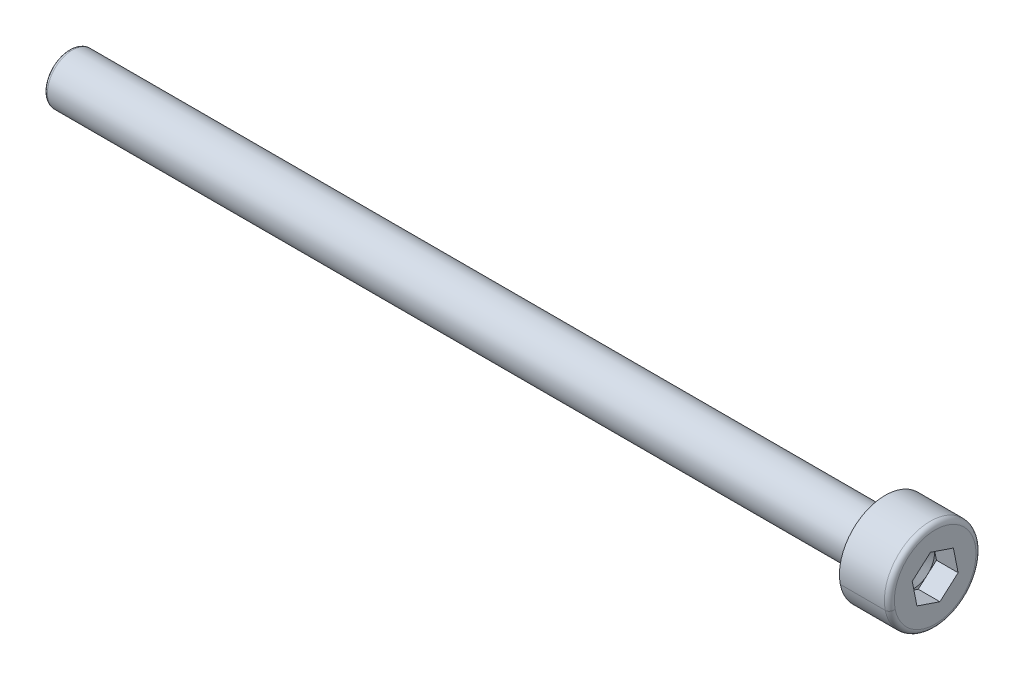
ISO-10303-21;
HEADER;
FILE_DESCRIPTION(('STEP AP214'),'2;1');
FILE_NAME('part.step','',(''),(''),'','','');
FILE_SCHEMA(('AUTOMOTIVE_DESIGN { 1 0 10303 214 1 1 1 1 }'));
ENDSEC;
DATA;
#1=APPLICATION_CONTEXT('core data for automotive mechanical design processes');
#2=APPLICATION_PROTOCOL_DEFINITION('international standard','automotive_design',2000,#1);
#3=PRODUCT_CONTEXT('',#1,'mechanical');
#4=PRODUCT('Part','Part','',(#3));
#5=PRODUCT_RELATED_PRODUCT_CATEGORY('part','',(#4));
#6=PRODUCT_DEFINITION_FORMATION('','',#4);
#7=PRODUCT_DEFINITION_CONTEXT('part definition',#1,'design');
#8=PRODUCT_DEFINITION('design','',#6,#7);
#9=PRODUCT_DEFINITION_SHAPE('','',#8);
#10=(LENGTH_UNIT() NAMED_UNIT(*) SI_UNIT(.MILLI.,.METRE.));
#11=(NAMED_UNIT(*) PLANE_ANGLE_UNIT() SI_UNIT($,.RADIAN.));
#12=(NAMED_UNIT(*) SI_UNIT($,.STERADIAN.) SOLID_ANGLE_UNIT());
#13=UNCERTAINTY_MEASURE_WITH_UNIT(LENGTH_MEASURE(1.E-05),#10,'distance_accuracy_value','');
#14=(GEOMETRIC_REPRESENTATION_CONTEXT(3) GLOBAL_UNCERTAINTY_ASSIGNED_CONTEXT((#13)) GLOBAL_UNIT_ASSIGNED_CONTEXT((#10,
#11,#12)) REPRESENTATION_CONTEXT('',''));
#15=CARTESIAN_POINT('',(0.,0.,0.));
#16=DIRECTION('',(0.,0.,1.));
#17=DIRECTION('',(1.,0.,0.));
#18=AXIS2_PLACEMENT_3D('',#15,#16,#17);
#19=CARTESIAN_POINT('',(151.775365407897,3.99157619912603,20.240540086776));
#20=DIRECTION('',(1.,0.,0.));
#21=DIRECTION('',(0.,0.195090322017057,-0.980785280403046));
#22=AXIS2_PLACEMENT_3D('',#19,#20,#21);
#23=CYLINDRICAL_SURFACE('',#22,1.5);
#24=CARTESIAN_POINT('',(68.225365407897,3.99157619912595,20.2405400867761));
#25=DIRECTION('',(-1.,0.,0.));
#26=DIRECTION('',(0.,0.,1.));
#27=AXIS2_PLACEMENT_3D('',#24,#25,#26);
#28=CIRCLE('',#27,1.5);
#29=CARTESIAN_POINT('',(68.225365407897,3.99157619912595,21.7405400867761));
#30=VERTEX_POINT('',#29);
#31=EDGE_CURVE('E11',#30,#30,#28,.F.);
#32=ORIENTED_EDGE('',*,*,#31,.T.);
#33=EDGE_LOOP('',(#32));
#34=FACE_BOUND('',#33,.T.);
#35=DIRECTION('',(1.,0.,0.));
#36=VECTOR('',#35,1.);
#37=CARTESIAN_POINT('',(151.775365407897,4.28421168215162,18.7693621661714));
#38=LINE('',#37,#36);
#39=CARTESIAN_POINT('',(88.025365407897,4.28421168215156,18.7693621661715));
#40=VERTEX_POINT('',#39);
#41=CARTESIAN_POINT('',(116.925365407897,4.28421168215158,18.7693621661714));
#42=VERTEX_POINT('',#41);
#43=EDGE_CURVE('E214',#40,#42,#38,.T.);
#44=ORIENTED_EDGE('',*,*,#43,.F.);
#45=ORIENTED_EDGE('',*,*,#43,.T.);
#46=CARTESIAN_POINT('',(116.925365407897,3.991576199126,20.240540086776));
#47=DIRECTION('',(-1.,0.,0.));
#48=DIRECTION('',(0.,-0.195090322017057,0.980785280403046));
#49=AXIS2_PLACEMENT_3D('',#46,#47,#48);
#50=CIRCLE('',#49,1.5);
#51=CARTESIAN_POINT('',(116.925365407897,3.69894071610041,21.7117180073806));
#52=VERTEX_POINT('',#51);
#53=EDGE_CURVE('E276',#42,#52,#50,.T.);
#54=ORIENTED_EDGE('',*,*,#53,.T.);
#55=DIRECTION('',(1.,0.,0.));
#56=VECTOR('',#55,1.);
#57=CARTESIAN_POINT('',(151.775365407897,3.69894071610045,21.7117180073805));
#58=LINE('',#57,#56);
#59=CARTESIAN_POINT('',(88.025365407897,3.69894071610038,21.7117180073806));
#60=VERTEX_POINT('',#59);
#61=EDGE_CURVE('E220',#60,#52,#58,.T.);
#62=ORIENTED_EDGE('',*,*,#61,.F.);
#63=ORIENTED_EDGE('',*,*,#61,.T.);
#64=CARTESIAN_POINT('',(116.925365407897,3.991576199126,20.240540086776));
#65=DIRECTION('',(-1.,0.,0.));
#66=DIRECTION('',(0.,-0.195090322017057,0.980785280403046));
#67=AXIS2_PLACEMENT_3D('',#64,#65,#66);
#68=CIRCLE('',#67,1.5);
#69=EDGE_CURVE('E217',#52,#42,#68,.T.);
#70=ORIENTED_EDGE('',*,*,#69,.T.);
#71=EDGE_LOOP('',(#44,#45,#54,#62,#63,#70));
#72=FACE_BOUND('',#71,.T.);
#73=ADVANCED_FACE('F50',(#34,#72),#23,.T.);
#74=CARTESIAN_POINT('',(118.725365407897,3.991576199126,20.240540086776));
#75=DIRECTION('',(1.,0.,0.));
#76=DIRECTION('',(0.,0.195090322017057,-0.980785280403046));
#77=AXIS2_PLACEMENT_3D('',#74,#75,#76);
#78=CONICAL_SURFACE('',#77,1.26,1.0471975511966);
#79=DIRECTION('',(0.500000000000001,-0.168953174899257,0.849384968486878));
#80=VECTOR('',#79,1.);
#81=CARTESIAN_POINT('',(118.725365407897,3.74576239338451,21.4763295400838));
#82=LINE('',#81,#80);
#83=CARTESIAN_POINT('',(117.997904068718,3.991576199126,20.240540086776));
#84=VERTEX_POINT('',#83);
#85=CARTESIAN_POINT('',(118.725365407897,3.74576239338451,21.4763295400838));
#86=VERTEX_POINT('',#85);
#87=EDGE_CURVE('E203',#84,#86,#82,.T.);
#88=ORIENTED_EDGE('',*,*,#87,.F.);
#89=DIRECTION('',(0.499999999999999,0.168953174899258,-0.849384968486879));
#90=VECTOR('',#89,1.);
#91=CARTESIAN_POINT('',(118.725365407897,4.23739000486749,19.0047506334682));
#92=LINE('',#91,#90);
#93=CARTESIAN_POINT('',(118.725365407897,4.23739000486749,19.0047506334682));
#94=VERTEX_POINT('',#93);
#95=EDGE_CURVE('E266',#84,#94,#92,.T.);
#96=ORIENTED_EDGE('',*,*,#95,.T.);
#97=CARTESIAN_POINT('',(118.725365407897,3.991576199126,20.240540086776));
#98=DIRECTION('',(1.,0.,0.));
#99=DIRECTION('',(0.,0.195090322017057,-0.980785280403046));
#100=AXIS2_PLACEMENT_3D('',#97,#98,#99);
#101=CIRCLE('',#100,1.26);
#102=CARTESIAN_POINT('',(118.725365407897,5.18470816229021,19.8355263604951));
#103=VERTEX_POINT('',#102);
#104=EDGE_CURVE('E209',#94,#103,#101,.T.);
#105=ORIENTED_EDGE('',*,*,#104,.T.);
#106=CARTESIAN_POINT('',(118.725365407897,3.991576199126,20.240540086776));
#107=DIRECTION('',(1.,0.,0.));
#108=DIRECTION('',(0.,0.195090322017057,-0.980785280403046));
#109=AXIS2_PLACEMENT_3D('',#106,#107,#108);
#110=CIRCLE('',#109,1.26);
#111=CARTESIAN_POINT('',(118.725365407897,4.93889435654872,21.071315813803));
#112=VERTEX_POINT('',#111);
#113=EDGE_CURVE('E212',#103,#112,#110,.T.);
#114=ORIENTED_EDGE('',*,*,#113,.T.);
#115=CARTESIAN_POINT('',(118.725365407897,3.991576199126,20.240540086776));
#116=DIRECTION('',(1.,0.,0.));
#117=DIRECTION('',(0.,0.195090322017057,-0.980785280403046));
#118=AXIS2_PLACEMENT_3D('',#115,#116,#117);
#119=CIRCLE('',#118,1.26);
#120=EDGE_CURVE('E71',#112,#86,#119,.T.);
#121=ORIENTED_EDGE('',*,*,#120,.T.);
#122=EDGE_LOOP('',(#88,#96,#105,#114,#121));
#123=FACE_BOUND('',#122,.T.);
#124=ADVANCED_FACE('F434',(#123),#78,.F.);
#125=CARTESIAN_POINT('',(118.725365407897,5.41854294618395,20.5243814206068));
#126=DIRECTION('',(-1.,0.,0.));
#127=DIRECTION('',(0.,0.980785280403046,0.195090322017057));
#128=AXIS2_PLACEMENT_3D('',#125,#126,#127);
#129=PLANE('',#128);
#130=DIRECTION('',(0.,-0.659345815100781,0.751839807478352));
#131=VECTOR('',#130,1.);
#132=CARTESIAN_POINT('',(118.725365407897,5.41854294618395,20.5243814206068));
#133=LINE('',#132,#131);
#134=CARTESIAN_POINT('',(118.725365407897,4.45924576691348,21.6182502069992));
#135=VERTEX_POINT('',#134);
#136=EDGE_CURVE('E238',#112,#135,#133,.T.);
#137=ORIENTED_EDGE('',*,*,#136,.T.);
#138=DIRECTION('',(0.,-0.980785280403045,-0.195090322017058));
#139=VECTOR('',#138,1.);
#140=CARTESIAN_POINT('',(118.725365407897,4.45924576691348,21.6182502069992));
#141=LINE('',#140,#139);
#142=EDGE_CURVE('E241',#135,#86,#141,.T.);
#143=ORIENTED_EDGE('',*,*,#142,.T.);
#144=ORIENTED_EDGE('',*,*,#120,.F.);
#145=EDGE_LOOP('',(#137,#143,#144));
#146=FACE_BOUND('',#145,.T.);
#147=ADVANCED_FACE('F436',(#146),#129,.F.);
#148=CARTESIAN_POINT('',(118.725365407897,5.41854294618395,20.5243814206068));
#149=DIRECTION('',(-1.,0.,0.));
#150=DIRECTION('',(0.,0.980785280403046,0.195090322017057));
#151=AXIS2_PLACEMENT_3D('',#148,#149,#150);
#152=PLANE('',#151);
#153=DIRECTION('',(0.,-0.321439465302265,-0.94693012949541));
#154=VECTOR('',#153,1.);
#155=CARTESIAN_POINT('',(118.725365407897,5.41854294618395,20.5243814206068));
#156=LINE('',#155,#154);
#157=CARTESIAN_POINT('',(118.725365407897,5.41854294618395,20.5243814206068));
#158=VERTEX_POINT('',#157);
#159=EDGE_CURVE('E309',#158,#103,#156,.T.);
#160=ORIENTED_EDGE('',*,*,#159,.F.);
#161=DIRECTION('',(0.,-0.659345815100781,0.751839807478352));
#162=VECTOR('',#161,1.);
#163=CARTESIAN_POINT('',(118.725365407897,5.41854294618395,20.5243814206068));
#164=LINE('',#163,#162);
#165=EDGE_CURVE('E213',#158,#112,#164,.T.);
#166=ORIENTED_EDGE('',*,*,#165,.T.);
#167=ORIENTED_EDGE('',*,*,#113,.F.);
#168=EDGE_LOOP('',(#160,#166,#167));
#169=FACE_BOUND('',#168,.T.);
#170=ADVANCED_FACE('F394',(#169),#152,.F.);
#171=CARTESIAN_POINT('',(118.725365407897,5.41854294618395,20.5243814206068));
#172=DIRECTION('',(-1.,0.,0.));
#173=DIRECTION('',(0.,0.980785280403046,0.195090322017057));
#174=AXIS2_PLACEMENT_3D('',#171,#172,#173);
#175=PLANE('',#174);
#176=DIRECTION('',(0.,0.980785280403045,0.195090322017058));
#177=VECTOR('',#176,1.);
#178=CARTESIAN_POINT('',(118.725365407897,3.52390663133851,18.8628299665528));
#179=LINE('',#178,#177);
#180=CARTESIAN_POINT('',(118.725365407897,4.95087337839647,19.1466713003835));
#181=VERTEX_POINT('',#180);
#182=EDGE_CURVE('E370',#94,#181,#179,.T.);
#183=ORIENTED_EDGE('',*,*,#182,.T.);
#184=DIRECTION('',(0.,-0.321439465302265,-0.94693012949541));
#185=VECTOR('',#184,1.);
#186=CARTESIAN_POINT('',(118.725365407897,5.41854294618395,20.5243814206068));
#187=LINE('',#186,#185);
#188=EDGE_CURVE('E207',#103,#181,#187,.T.);
#189=ORIENTED_EDGE('',*,*,#188,.F.);
#190=ORIENTED_EDGE('',*,*,#104,.F.);
#191=EDGE_LOOP('',(#183,#189,#190));
#192=FACE_BOUND('',#191,.T.);
#193=ADVANCED_FACE('F383',(#192),#175,.F.);
#194=CARTESIAN_POINT('',(118.725365407897,5.41854294618395,20.5243814206068));
#195=DIRECTION('',(-1.,0.,0.));
#196=DIRECTION('',(0.,0.980785280403046,0.195090322017057));
#197=AXIS2_PLACEMENT_3D('',#194,#195,#196);
#198=PLANE('',#197);
#199=DIRECTION('',(0.,-0.659345815100781,0.751839807478352));
#200=VECTOR('',#199,1.);
#201=CARTESIAN_POINT('',(118.725365407897,3.52390663133851,18.8628299665528));
#202=LINE('',#201,#200);
#203=CARTESIAN_POINT('',(118.725365407897,3.52390663133851,18.8628299665528));
#204=VERTEX_POINT('',#203);
#205=CARTESIAN_POINT('',(118.725365407897,3.04425804170327,19.409764359749));
#206=VERTEX_POINT('',#205);
#207=EDGE_CURVE('E169',#204,#206,#202,.T.);
#208=ORIENTED_EDGE('',*,*,#207,.F.);
#209=DIRECTION('',(0.,0.980785280403045,0.195090322017058));
#210=VECTOR('',#209,1.);
#211=CARTESIAN_POINT('',(118.725365407897,3.52390663133851,18.8628299665528));
#212=LINE('',#211,#210);
#213=EDGE_CURVE('E185',#204,#94,#212,.T.);
#214=ORIENTED_EDGE('',*,*,#213,.T.);
#215=CARTESIAN_POINT('',(118.725365407897,3.991576199126,20.240540086776));
#216=DIRECTION('',(1.,0.,0.));
#217=DIRECTION('',(0.,0.195090322017057,-0.980785280403046));
#218=AXIS2_PLACEMENT_3D('',#215,#216,#217);
#219=CIRCLE('',#218,1.26);
#220=EDGE_CURVE('E183',#206,#94,#219,.T.);
#221=ORIENTED_EDGE('',*,*,#220,.F.);
#222=EDGE_LOOP('',(#208,#214,#221));
#223=FACE_BOUND('',#222,.T.);
#224=ADVANCED_FACE('F184',(#223),#198,.F.);
#225=CARTESIAN_POINT('',(118.725365407897,5.41854294618395,20.5243814206068));
#226=DIRECTION('',(-1.,0.,0.));
#227=DIRECTION('',(0.,0.980785280403046,0.195090322017057));
#228=AXIS2_PLACEMENT_3D('',#225,#226,#227);
#229=PLANE('',#228);
#230=DIRECTION('',(0.,0.321439465302265,0.94693012949541));
#231=VECTOR('',#230,1.);
#232=CARTESIAN_POINT('',(118.725365407897,2.56460945206803,19.9566987529453));
#233=LINE('',#232,#231);
#234=CARTESIAN_POINT('',(118.725365407897,2.56460945206803,19.9566987529453));
#235=VERTEX_POINT('',#234);
#236=CARTESIAN_POINT('',(118.725365407897,2.79844423596177,20.6455538130569));
#237=VERTEX_POINT('',#236);
#238=EDGE_CURVE('E163',#235,#237,#233,.T.);
#239=ORIENTED_EDGE('',*,*,#238,.F.);
#240=DIRECTION('',(0.,-0.659345815100781,0.751839807478352));
#241=VECTOR('',#240,1.);
#242=CARTESIAN_POINT('',(118.725365407897,3.52390663133851,18.8628299665528));
#243=LINE('',#242,#241);
#244=EDGE_CURVE('E156',#206,#235,#243,.T.);
#245=ORIENTED_EDGE('',*,*,#244,.F.);
#246=CARTESIAN_POINT('',(118.725365407897,3.991576199126,20.240540086776));
#247=DIRECTION('',(1.,0.,0.));
#248=DIRECTION('',(0.,0.195090322017057,-0.980785280403046));
#249=AXIS2_PLACEMENT_3D('',#246,#247,#248);
#250=CIRCLE('',#249,1.26);
#251=EDGE_CURVE('E160',#237,#206,#250,.T.);
#252=ORIENTED_EDGE('',*,*,#251,.F.);
#253=EDGE_LOOP('',(#239,#245,#252));
#254=FACE_BOUND('',#253,.T.);
#255=ADVANCED_FACE('F158',(#254),#229,.F.);
#256=CARTESIAN_POINT('',(118.725365407897,5.41854294618395,20.5243814206068));
#257=DIRECTION('',(-1.,0.,0.));
#258=DIRECTION('',(0.,0.980785280403046,0.195090322017057));
#259=AXIS2_PLACEMENT_3D('',#256,#257,#258);
#260=PLANE('',#259);
#261=DIRECTION('',(0.,-0.980785280403045,-0.195090322017058));
#262=VECTOR('',#261,1.);
#263=CARTESIAN_POINT('',(118.725365407897,4.45924576691348,21.6182502069992));
#264=LINE('',#263,#262);
#265=CARTESIAN_POINT('',(118.725365407897,3.03227901985552,21.3344088731685));
#266=VERTEX_POINT('',#265);
#267=EDGE_CURVE('E251',#86,#266,#264,.T.);
#268=ORIENTED_EDGE('',*,*,#267,.T.);
#269=DIRECTION('',(0.,0.321439465302265,0.94693012949541));
#270=VECTOR('',#269,1.);
#271=CARTESIAN_POINT('',(118.725365407897,2.56460945206803,19.9566987529453));
#272=LINE('',#271,#270);
#273=EDGE_CURVE('E267',#237,#266,#272,.T.);
#274=ORIENTED_EDGE('',*,*,#273,.F.);
#275=CARTESIAN_POINT('',(118.725365407897,3.991576199126,20.240540086776));
#276=DIRECTION('',(1.,0.,0.));
#277=DIRECTION('',(0.,0.195090322017057,-0.980785280403046));
#278=AXIS2_PLACEMENT_3D('',#275,#276,#277);
#279=CIRCLE('',#278,1.26);
#280=EDGE_CURVE('E196',#86,#237,#279,.T.);
#281=ORIENTED_EDGE('',*,*,#280,.F.);
#282=EDGE_LOOP('',(#268,#274,#281));
#283=FACE_BOUND('',#282,.T.);
#284=ADVANCED_FACE('F433',(#283),#260,.F.);
#285=CARTESIAN_POINT('',(118.725365407897,5.41854294618395,20.5243814206068));
#286=DIRECTION('',(0.,0.751839807478352,0.659345815100781));
#287=DIRECTION('',(1.,0.,0.));
#288=AXIS2_PLACEMENT_3D('',#285,#286,#287);
#289=PLANE('',#288);
#290=DIRECTION('',(0.,-0.659345815100781,0.751839807478352));
#291=VECTOR('',#290,1.);
#292=CARTESIAN_POINT('',(120.025365407897,5.41854294618395,20.5243814206068));
#293=LINE('',#292,#291);
#294=CARTESIAN_POINT('',(120.025365407897,5.41854294618395,20.5243814206068));
#295=VERTEX_POINT('',#294);
#296=CARTESIAN_POINT('',(120.025365407897,4.45924576691348,21.6182502069992));
#297=VERTEX_POINT('',#296);
#298=EDGE_CURVE('E312',#295,#297,#293,.T.);
#299=ORIENTED_EDGE('',*,*,#298,.T.);
#300=DIRECTION('',(1.,0.,0.));
#301=VECTOR('',#300,1.);
#302=CARTESIAN_POINT('',(118.725365407897,4.45924576691348,21.6182502069992));
#303=LINE('',#302,#301);
#304=EDGE_CURVE('E239',#135,#297,#303,.T.);
#305=ORIENTED_EDGE('',*,*,#304,.F.);
#306=ORIENTED_EDGE('',*,*,#136,.F.);
#307=ORIENTED_EDGE('',*,*,#165,.F.);
#308=DIRECTION('',(1.,0.,0.));
#309=VECTOR('',#308,1.);
#310=CARTESIAN_POINT('',(118.725365407897,5.41854294618395,20.5243814206068));
#311=LINE('',#310,#309);
#312=EDGE_CURVE('E305',#158,#295,#311,.T.);
#313=ORIENTED_EDGE('',*,*,#312,.T.);
#314=EDGE_LOOP('',(#299,#305,#306,#307,#313));
#315=FACE_BOUND('',#314,.T.);
#316=ADVANCED_FACE('F455',(#315),#289,.F.);
#317=CARTESIAN_POINT('',(118.725365407897,4.45924576691348,21.6182502069992));
#318=DIRECTION('',(0.,-0.195090322017058,0.980785280403045));
#319=DIRECTION('',(0.,-0.980785280403045,-0.195090322017058));
#320=AXIS2_PLACEMENT_3D('',#317,#318,#319);
#321=PLANE('',#320);
#322=DIRECTION('',(0.,-0.980785280403045,-0.195090322017058));
#323=VECTOR('',#322,1.);
#324=CARTESIAN_POINT('',(120.025365407897,4.45924576691348,21.6182502069992));
#325=LINE('',#324,#323);
#326=CARTESIAN_POINT('',(120.025365407897,3.03227901985552,21.3344088731685));
#327=VERTEX_POINT('',#326);
#328=EDGE_CURVE('E320',#297,#327,#325,.T.);
#329=ORIENTED_EDGE('',*,*,#328,.T.);
#330=DIRECTION('',(1.,0.,0.));
#331=VECTOR('',#330,1.);
#332=CARTESIAN_POINT('',(118.725365407897,3.03227901985552,21.3344088731685));
#333=LINE('',#332,#331);
#334=EDGE_CURVE('E259',#266,#327,#333,.T.);
#335=ORIENTED_EDGE('',*,*,#334,.F.);
#336=ORIENTED_EDGE('',*,*,#267,.F.);
#337=ORIENTED_EDGE('',*,*,#142,.F.);
#338=ORIENTED_EDGE('',*,*,#304,.T.);
#339=EDGE_LOOP('',(#329,#335,#336,#337,#338));
#340=FACE_BOUND('',#339,.T.);
#341=ADVANCED_FACE('F431',(#340),#321,.F.);
#342=CARTESIAN_POINT('',(118.725365407897,2.56460945206803,19.9566987529453));
#343=DIRECTION('',(0.,0.94693012949541,-0.321439465302265));
#344=DIRECTION('',(-1.,0.,0.));
#345=AXIS2_PLACEMENT_3D('',#342,#343,#344);
#346=PLANE('',#345);
#347=DIRECTION('',(0.,0.321439465302265,0.94693012949541));
#348=VECTOR('',#347,1.);
#349=CARTESIAN_POINT('',(120.025365407897,2.56460945206803,19.9566987529452));
#350=LINE('',#349,#348);
#351=CARTESIAN_POINT('',(120.025365407897,2.56460945206803,19.9566987529452));
#352=VERTEX_POINT('',#351);
#353=EDGE_CURVE('E329',#352,#327,#350,.T.);
#354=ORIENTED_EDGE('',*,*,#353,.F.);
#355=DIRECTION('',(1.,0.,0.));
#356=VECTOR('',#355,1.);
#357=CARTESIAN_POINT('',(118.725365407897,2.56460945206803,19.9566987529453));
#358=LINE('',#357,#356);
#359=EDGE_CURVE('E168',#235,#352,#358,.T.);
#360=ORIENTED_EDGE('',*,*,#359,.F.);
#361=ORIENTED_EDGE('',*,*,#238,.T.);
#362=ORIENTED_EDGE('',*,*,#273,.T.);
#363=ORIENTED_EDGE('',*,*,#334,.T.);
#364=EDGE_LOOP('',(#354,#360,#361,#362,#363));
#365=FACE_BOUND('',#364,.T.);
#366=ADVANCED_FACE('F428',(#365),#346,.T.);
#367=CARTESIAN_POINT('',(118.725365407897,3.52390663133851,18.8628299665528));
#368=DIRECTION('',(0.,0.751839807478352,0.659345815100781));
#369=DIRECTION('',(1.,0.,0.));
#370=AXIS2_PLACEMENT_3D('',#367,#368,#369);
#371=PLANE('',#370);
#372=DIRECTION('',(0.,-0.659345815100781,0.751839807478352));
#373=VECTOR('',#372,1.);
#374=CARTESIAN_POINT('',(120.025365407897,3.52390663133851,18.8628299665528));
#375=LINE('',#374,#373);
#376=CARTESIAN_POINT('',(120.025365407897,3.52390663133851,18.8628299665528));
#377=VERTEX_POINT('',#376);
#378=EDGE_CURVE('E348',#377,#352,#375,.T.);
#379=ORIENTED_EDGE('',*,*,#378,.F.);
#380=DIRECTION('',(1.,0.,0.));
#381=VECTOR('',#380,1.);
#382=CARTESIAN_POINT('',(118.725365407897,3.52390663133851,18.8628299665528));
#383=LINE('',#382,#381);
#384=EDGE_CURVE('E176',#204,#377,#383,.T.);
#385=ORIENTED_EDGE('',*,*,#384,.F.);
#386=ORIENTED_EDGE('',*,*,#207,.T.);
#387=ORIENTED_EDGE('',*,*,#244,.T.);
#388=ORIENTED_EDGE('',*,*,#359,.T.);
#389=EDGE_LOOP('',(#379,#385,#386,#387,#388));
#390=FACE_BOUND('',#389,.T.);
#391=ADVANCED_FACE('F174',(#390),#371,.T.);
#392=CARTESIAN_POINT('',(118.725365407897,3.52390663133851,18.8628299665528));
#393=DIRECTION('',(0.,0.195090322017058,-0.980785280403045));
#394=DIRECTION('',(0.,-0.980785280403045,-0.195090322017058));
#395=AXIS2_PLACEMENT_3D('',#392,#393,#394);
#396=PLANE('',#395);
#397=DIRECTION('',(0.,0.980785280403045,0.195090322017058));
#398=VECTOR('',#397,1.);
#399=CARTESIAN_POINT('',(120.025365407897,3.52390663133851,18.8628299665528));
#400=LINE('',#399,#398);
#401=CARTESIAN_POINT('',(120.025365407897,4.95087337839647,19.1466713003835));
#402=VERTEX_POINT('',#401);
#403=EDGE_CURVE('E281',#377,#402,#400,.T.);
#404=ORIENTED_EDGE('',*,*,#403,.T.);
#405=DIRECTION('',(1.,0.,0.));
#406=VECTOR('',#405,1.);
#407=CARTESIAN_POINT('',(118.725365407897,4.95087337839647,19.1466713003835));
#408=LINE('',#407,#406);
#409=EDGE_CURVE('E368',#181,#402,#408,.T.);
#410=ORIENTED_EDGE('',*,*,#409,.F.);
#411=ORIENTED_EDGE('',*,*,#182,.F.);
#412=ORIENTED_EDGE('',*,*,#213,.F.);
#413=ORIENTED_EDGE('',*,*,#384,.T.);
#414=EDGE_LOOP('',(#404,#410,#411,#412,#413));
#415=FACE_BOUND('',#414,.T.);
#416=ADVANCED_FACE('F385',(#415),#396,.F.);
#417=CARTESIAN_POINT('',(118.725365407897,5.41854294618395,20.5243814206068));
#418=DIRECTION('',(0.,-0.94693012949541,0.321439465302265));
#419=DIRECTION('',(0.,0.321439465302265,0.94693012949541));
#420=AXIS2_PLACEMENT_3D('',#417,#418,#419);
#421=PLANE('',#420);
#422=DIRECTION('',(0.,-0.321439465302265,-0.94693012949541));
#423=VECTOR('',#422,1.);
#424=CARTESIAN_POINT('',(120.025365407897,5.41854294618395,20.5243814206068));
#425=LINE('',#424,#423);
#426=EDGE_CURVE('E277',#295,#402,#425,.T.);
#427=ORIENTED_EDGE('',*,*,#426,.F.);
#428=ORIENTED_EDGE('',*,*,#312,.F.);
#429=ORIENTED_EDGE('',*,*,#159,.T.);
#430=ORIENTED_EDGE('',*,*,#188,.T.);
#431=ORIENTED_EDGE('',*,*,#409,.T.);
#432=EDGE_LOOP('',(#427,#428,#429,#430,#431));
#433=FACE_BOUND('',#432,.T.);
#434=ADVANCED_FACE('F388',(#433),#421,.T.);
#435=CARTESIAN_POINT('',(119.725365407897,3.991576199126,20.240540086776));
#436=DIRECTION('',(1.,0.,0.));
#437=DIRECTION('',(0.,0.195090322017057,-0.980785280403046));
#438=AXIS2_PLACEMENT_3D('',#435,#436,#437);
#439=TOROIDAL_SURFACE('',#438,2.45,0.3);
#440=CARTESIAN_POINT('',(119.725365407897,3.51360491018421,22.6434640237635));
#441=DIRECTION('',(0.,0.980785280403046,0.195090322017057));
#442=DIRECTION('',(0.,0.195090322017057,-0.980785280403046));
#443=AXIS2_PLACEMENT_3D('',#440,#441,#442);
#444=CIRCLE('',#443,0.3);
#445=CARTESIAN_POINT('',(119.725365407897,3.45507781357909,22.9376996078844));
#446=VERTEX_POINT('',#445);
#447=CARTESIAN_POINT('',(120.025365407897,3.51360491018421,22.6434640237635));
#448=VERTEX_POINT('',#447);
#449=EDGE_CURVE('E336',#446,#448,#444,.T.);
#450=ORIENTED_EDGE('',*,*,#449,.F.);
#451=CARTESIAN_POINT('',(119.725365407897,3.991576199126,20.240540086776));
#452=DIRECTION('',(-1.,0.,0.));
#453=DIRECTION('',(0.,0.195090322017057,-0.980785280403046));
#454=AXIS2_PLACEMENT_3D('',#451,#452,#453);
#455=CIRCLE('',#454,2.75);
#456=CARTESIAN_POINT('',(119.725365407897,4.52807458467291,17.5433805656676));
#457=VERTEX_POINT('',#456);
#458=EDGE_CURVE('E300',#457,#446,#455,.T.);
#459=ORIENTED_EDGE('',*,*,#458,.F.);
#460=CARTESIAN_POINT('',(119.725365407897,4.46954748806779,17.8376161497885));
#461=DIRECTION('',(0.,-0.980785280403046,-0.195090322017057));
#462=DIRECTION('',(0.,-0.195090322017057,0.980785280403046));
#463=AXIS2_PLACEMENT_3D('',#460,#461,#462);
#464=CIRCLE('',#463,0.3);
#465=CARTESIAN_POINT('',(120.025365407897,4.46954748806779,17.8376161497885));
#466=VERTEX_POINT('',#465);
#467=EDGE_CURVE('E263',#457,#466,#464,.T.);
#468=ORIENTED_EDGE('',*,*,#467,.T.);
#469=CARTESIAN_POINT('',(120.025365407897,3.991576199126,20.240540086776));
#470=DIRECTION('',(1.,0.,0.));
#471=DIRECTION('',(0.,0.195090322017057,-0.980785280403046));
#472=AXIS2_PLACEMENT_3D('',#469,#470,#471);
#473=CIRCLE('',#472,2.45);
#474=EDGE_CURVE('E136',#448,#466,#473,.T.);
#475=ORIENTED_EDGE('',*,*,#474,.F.);
#476=EDGE_LOOP('',(#450,#459,#468,#475));
#477=FACE_BOUND('',#476,.T.);
#478=ADVANCED_FACE('F449',(#477),#439,.T.);
#479=CARTESIAN_POINT('',(116.925365407897,3.991576199126,20.240540086776));
#480=DIRECTION('',(-1.,0.,0.));
#481=DIRECTION('',(0.,-0.195090322017057,0.980785280403046));
#482=AXIS2_PLACEMENT_3D('',#479,#480,#481);
#483=TOROIDAL_SURFACE('',#482,1.6,0.1);
#484=CARTESIAN_POINT('',(116.925365407897,4.30372071435329,18.6712836381311));
#485=DIRECTION('',(0.,0.980785280403046,0.195090322017057));
#486=DIRECTION('',(0.,0.195090322017057,-0.980785280403046));
#487=AXIS2_PLACEMENT_3D('',#484,#485,#486);
#488=CIRCLE('',#487,0.1);
#489=CARTESIAN_POINT('',(117.025365407897,4.30372071435329,18.6712836381311));
#490=VERTEX_POINT('',#489);
#491=EDGE_CURVE('E271',#42,#490,#488,.T.);
#492=ORIENTED_EDGE('',*,*,#491,.F.);
#493=ORIENTED_EDGE('',*,*,#69,.F.);
#494=CARTESIAN_POINT('',(116.925365407897,3.67943168389871,21.8097965354209));
#495=DIRECTION('',(0.,-0.980785280403046,-0.195090322017057));
#496=DIRECTION('',(0.,-0.195090322017057,0.980785280403046));
#497=AXIS2_PLACEMENT_3D('',#494,#495,#496);
#498=CIRCLE('',#497,0.1);
#499=CARTESIAN_POINT('',(117.025365407897,3.67943168389871,21.8097965354209));
#500=VERTEX_POINT('',#499);
#501=EDGE_CURVE('E222',#52,#500,#498,.T.);
#502=ORIENTED_EDGE('',*,*,#501,.T.);
#503=CARTESIAN_POINT('',(117.025365407897,3.991576199126,20.240540086776));
#504=DIRECTION('',(1.,0.,0.));
#505=DIRECTION('',(0.,-0.195090322017057,0.980785280403046));
#506=AXIS2_PLACEMENT_3D('',#503,#504,#505);
#507=CIRCLE('',#506,1.6);
#508=EDGE_CURVE('E303',#490,#500,#507,.T.);
#509=ORIENTED_EDGE('',*,*,#508,.F.);
#510=EDGE_LOOP('',(#492,#493,#502,#509));
#511=FACE_BOUND('',#510,.T.);
#512=ADVANCED_FACE('F452',(#511),#483,.F.);
#513=CARTESIAN_POINT('',(117.025365407897,6.68873572023437,20.7770384723229));
#514=DIRECTION('',(-1.,0.,0.));
#515=DIRECTION('',(0.,0.980785280403046,0.195090322017057));
#516=AXIS2_PLACEMENT_3D('',#513,#514,#515);
#517=PLANE('',#516);
#518=CARTESIAN_POINT('',(117.025365407897,3.991576199126,20.240540086776));
#519=DIRECTION('',(1.,0.,0.));
#520=DIRECTION('',(0.,-0.195090322017057,0.980785280403046));
#521=AXIS2_PLACEMENT_3D('',#518,#519,#520);
#522=CIRCLE('',#521,1.6);
#523=EDGE_CURVE('E275',#500,#490,#522,.T.);
#524=ORIENTED_EDGE('',*,*,#523,.T.);
#525=ORIENTED_EDGE('',*,*,#508,.T.);
#526=EDGE_LOOP('',(#524,#525));
#527=FACE_BOUND('',#526,.T.);
#528=CARTESIAN_POINT('',(117.025365407897,3.991576199126,20.240540086776));
#529=DIRECTION('',(1.,0.,0.));
#530=DIRECTION('',(0.,0.195090322017057,-0.980785280403046));
#531=AXIS2_PLACEMENT_3D('',#528,#529,#530);
#532=CIRCLE('',#531,2.75);
#533=CARTESIAN_POINT('',(117.025365407897,4.5280745846729,17.5433805656676));
#534=VERTEX_POINT('',#533);
#535=CARTESIAN_POINT('',(117.025365407897,3.45507781357909,22.9376996078844));
#536=VERTEX_POINT('',#535);
#537=EDGE_CURVE('E216',#534,#536,#532,.T.);
#538=ORIENTED_EDGE('',*,*,#537,.F.);
#539=CARTESIAN_POINT('',(117.025365407897,3.991576199126,20.240540086776));
#540=DIRECTION('',(1.,0.,0.));
#541=DIRECTION('',(0.,0.195090322017057,-0.980785280403046));
#542=AXIS2_PLACEMENT_3D('',#539,#540,#541);
#543=CIRCLE('',#542,2.75);
#544=EDGE_CURVE('E304',#536,#534,#543,.T.);
#545=ORIENTED_EDGE('',*,*,#544,.F.);
#546=EDGE_LOOP('',(#538,#545));
#547=FACE_BOUND('',#546,.T.);
#548=ADVANCED_FACE('F467',(#527,#547),#517,.T.);
#549=CARTESIAN_POINT('',(151.775365407897,3.99157619912603,20.240540086776));
#550=DIRECTION('',(1.,0.,0.));
#551=DIRECTION('',(0.,0.195090322017057,-0.980785280403046));
#552=AXIS2_PLACEMENT_3D('',#549,#550,#551);
#553=CYLINDRICAL_SURFACE('',#552,2.75);
#554=DIRECTION('',(1.,0.,0.));
#555=VECTOR('',#554,1.);
#556=CARTESIAN_POINT('',(151.775365407897,3.45507781357913,22.9376996078843));
#557=LINE('',#556,#555);
#558=EDGE_CURVE('E286',#536,#446,#557,.T.);
#559=ORIENTED_EDGE('',*,*,#558,.F.);
#560=ORIENTED_EDGE('',*,*,#544,.T.);
#561=DIRECTION('',(1.,0.,0.));
#562=VECTOR('',#561,1.);
#563=CARTESIAN_POINT('',(151.775365407897,4.52807458467294,17.5433805656676));
#564=LINE('',#563,#562);
#565=EDGE_CURVE('E282',#534,#457,#564,.T.);
#566=ORIENTED_EDGE('',*,*,#565,.T.);
#567=ORIENTED_EDGE('',*,*,#458,.T.);
#568=EDGE_LOOP('',(#559,#560,#566,#567));
#569=FACE_BOUND('',#568,.T.);
#570=ADVANCED_FACE('F448',(#569),#553,.T.);
#571=CARTESIAN_POINT('',(120.025365407897,3.991576199126,20.240540086776));
#572=DIRECTION('',(1.,0.,0.));
#573=DIRECTION('',(0.,0.195090322017057,-0.980785280403046));
#574=AXIS2_PLACEMENT_3D('',#571,#572,#573);
#575=PLANE('',#574);
#576=ORIENTED_EDGE('',*,*,#426,.T.);
#577=ORIENTED_EDGE('',*,*,#403,.F.);
#578=ORIENTED_EDGE('',*,*,#378,.T.);
#579=ORIENTED_EDGE('',*,*,#353,.T.);
#580=ORIENTED_EDGE('',*,*,#328,.F.);
#581=ORIENTED_EDGE('',*,*,#298,.F.);
#582=EDGE_LOOP('',(#576,#577,#578,#579,#580,#581));
#583=FACE_BOUND('',#582,.T.);
#584=CARTESIAN_POINT('',(120.025365407897,3.991576199126,20.240540086776));
#585=DIRECTION('',(1.,0.,0.));
#586=DIRECTION('',(0.,0.195090322017057,-0.980785280403046));
#587=AXIS2_PLACEMENT_3D('',#584,#585,#586);
#588=CIRCLE('',#587,2.45);
#589=EDGE_CURVE('E340',#466,#448,#588,.T.);
#590=ORIENTED_EDGE('',*,*,#589,.T.);
#591=ORIENTED_EDGE('',*,*,#474,.T.);
#592=EDGE_LOOP('',(#590,#591));
#593=FACE_BOUND('',#592,.T.);
#594=ADVANCED_FACE('F430',(#583,#593),#575,.T.);
#595=CARTESIAN_POINT('',(151.775365407897,3.99157619912603,20.240540086776));
#596=DIRECTION('',(1.,0.,0.));
#597=DIRECTION('',(0.,0.195090322017057,-0.980785280403046));
#598=AXIS2_PLACEMENT_3D('',#595,#596,#597);
#599=CYLINDRICAL_SURFACE('',#598,2.75);
#600=ORIENTED_EDGE('',*,*,#537,.T.);
#601=ORIENTED_EDGE('',*,*,#558,.T.);
#602=CARTESIAN_POINT('',(119.725365407897,3.991576199126,20.240540086776));
#603=DIRECTION('',(-1.,0.,0.));
#604=DIRECTION('',(0.,0.195090322017057,-0.980785280403046));
#605=AXIS2_PLACEMENT_3D('',#602,#603,#604);
#606=CIRCLE('',#605,2.75);
#607=EDGE_CURVE('E191',#446,#457,#606,.T.);
#608=ORIENTED_EDGE('',*,*,#607,.T.);
#609=ORIENTED_EDGE('',*,*,#565,.F.);
#610=EDGE_LOOP('',(#600,#601,#608,#609));
#611=FACE_BOUND('',#610,.T.);
#612=ADVANCED_FACE('F447',(#611),#599,.T.);
#613=CARTESIAN_POINT('',(116.925365407897,3.991576199126,20.240540086776));
#614=DIRECTION('',(-1.,0.,0.));
#615=DIRECTION('',(0.,-0.195090322017057,0.980785280403046));
#616=AXIS2_PLACEMENT_3D('',#613,#614,#615);
#617=TOROIDAL_SURFACE('',#616,1.6,0.1);
#618=ORIENTED_EDGE('',*,*,#53,.F.);
#619=ORIENTED_EDGE('',*,*,#491,.T.);
#620=ORIENTED_EDGE('',*,*,#523,.F.);
#621=ORIENTED_EDGE('',*,*,#501,.F.);
#622=EDGE_LOOP('',(#618,#619,#620,#621));
#623=FACE_BOUND('',#622,.T.);
#624=ADVANCED_FACE('F458',(#623),#617,.F.);
#625=CARTESIAN_POINT('',(119.725365407897,3.991576199126,20.240540086776));
#626=DIRECTION('',(1.,0.,0.));
#627=DIRECTION('',(0.,0.195090322017057,-0.980785280403046));
#628=AXIS2_PLACEMENT_3D('',#625,#626,#627);
#629=TOROIDAL_SURFACE('',#628,2.45,0.3);
#630=ORIENTED_EDGE('',*,*,#607,.F.);
#631=ORIENTED_EDGE('',*,*,#449,.T.);
#632=ORIENTED_EDGE('',*,*,#589,.F.);
#633=ORIENTED_EDGE('',*,*,#467,.F.);
#634=EDGE_LOOP('',(#630,#631,#632,#633));
#635=FACE_BOUND('',#634,.T.);
#636=ADVANCED_FACE('F460',(#635),#629,.T.);
#637=CARTESIAN_POINT('',(118.725365407897,3.991576199126,20.240540086776));
#638=DIRECTION('',(1.,0.,0.));
#639=DIRECTION('',(0.,0.195090322017057,-0.980785280403046));
#640=AXIS2_PLACEMENT_3D('',#637,#638,#639);
#641=CONICAL_SURFACE('',#640,1.26,1.0471975511966);
#642=ORIENTED_EDGE('',*,*,#95,.F.);
#643=ORIENTED_EDGE('',*,*,#87,.T.);
#644=ORIENTED_EDGE('',*,*,#280,.T.);
#645=ORIENTED_EDGE('',*,*,#251,.T.);
#646=ORIENTED_EDGE('',*,*,#220,.T.);
#647=EDGE_LOOP('',(#642,#643,#644,#645,#646));
#648=FACE_BOUND('',#647,.T.);
#649=ADVANCED_FACE('F193',(#648),#641,.F.);
#650=CARTESIAN_POINT('',(68.025365407897,3.99157619912595,20.2405400867761));
#651=DIRECTION('',(-1.,0.,0.));
#652=DIRECTION('',(0.,0.,1.));
#653=AXIS2_PLACEMENT_3D('',#650,#651,#652);
#654=PLANE('',#653);
#655=CARTESIAN_POINT('',(68.025365407897,3.99157619912595,20.2405400867761));
#656=DIRECTION('',(-1.,0.,0.));
#657=DIRECTION('',(0.,0.,1.));
#658=AXIS2_PLACEMENT_3D('',#655,#656,#657);
#659=CIRCLE('',#658,1.3);
#660=CARTESIAN_POINT('',(68.025365407897,3.99157619912595,21.5405400867761));
#661=VERTEX_POINT('',#660);
#662=EDGE_CURVE('E59',#661,#661,#659,.T.);
#663=ORIENTED_EDGE('',*,*,#662,.T.);
#664=EDGE_LOOP('',(#663));
#665=FACE_BOUND('',#664,.T.);
#666=ADVANCED_FACE('F487',(#665),#654,.T.);
#667=CARTESIAN_POINT('',(68.225365407897,3.99157619912595,20.2405400867761));
#668=DIRECTION('',(-1.,0.,0.));
#669=DIRECTION('',(0.,0.,1.));
#670=AXIS2_PLACEMENT_3D('',#667,#668,#669);
#671=TOROIDAL_SURFACE('',#670,1.3,0.2);
#672=ORIENTED_EDGE('',*,*,#31,.F.);
#673=EDGE_LOOP('',(#672));
#674=FACE_BOUND('',#673,.T.);
#675=ORIENTED_EDGE('',*,*,#662,.F.);
#676=EDGE_LOOP('',(#675));
#677=FACE_BOUND('',#676,.T.);
#678=ADVANCED_FACE('F52',(#674,#677),#671,.T.);
#679=CLOSED_SHELL('',(#73,#124,#147,#170,#193,#224,#255,#284,#316,#341,#366,#391,#416,#434,#478,
#512,#548,#570,#594,#612,#624,#636,#649,#666,#678));
#680=MANIFOLD_SOLID_BREP('B2',#679);
#681=ADVANCED_BREP_SHAPE_REPRESENTATION('',(#18,#680),#14);
#682=SHAPE_DEFINITION_REPRESENTATION(#9,#681);
ENDSEC;
END-ISO-10303-21;
